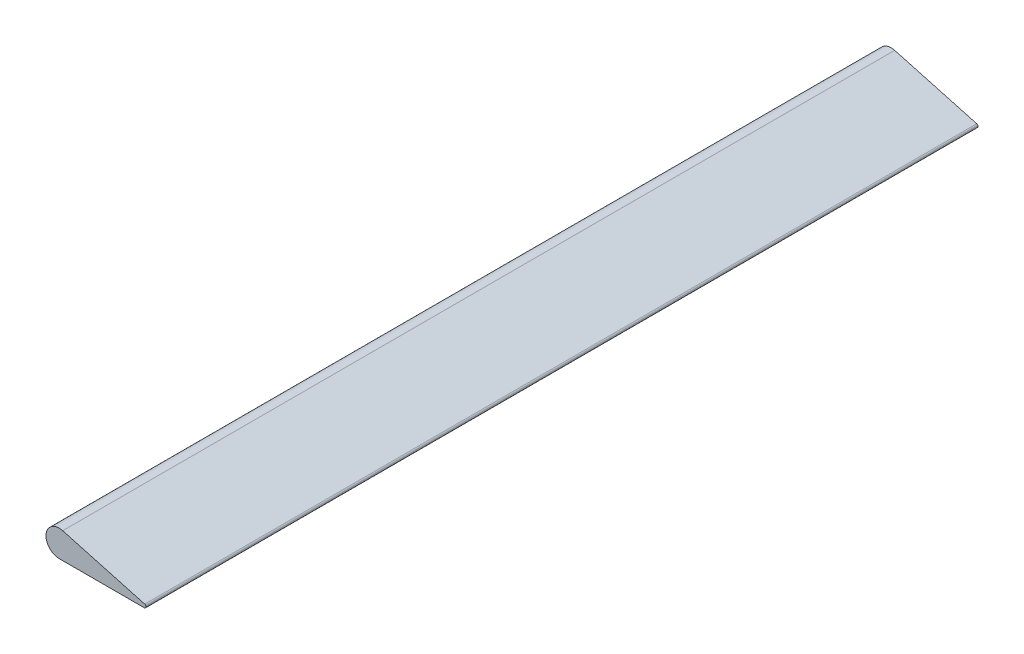
ISO-10303-21;
HEADER;
FILE_DESCRIPTION(('STEP AP214'),'2;1');
FILE_NAME('part.step','',(''),(''),'','','');
FILE_SCHEMA(('AUTOMOTIVE_DESIGN { 1 0 10303 214 1 1 1 1 }'));
ENDSEC;
DATA;
#1=APPLICATION_CONTEXT('core data for automotive mechanical design processes');
#2=APPLICATION_PROTOCOL_DEFINITION('international standard','automotive_design',2000,#1);
#3=PRODUCT_CONTEXT('',#1,'mechanical');
#4=PRODUCT('Part','Part','',(#3));
#5=PRODUCT_RELATED_PRODUCT_CATEGORY('part','',(#4));
#6=PRODUCT_DEFINITION_FORMATION('','',#4);
#7=PRODUCT_DEFINITION_CONTEXT('part definition',#1,'design');
#8=PRODUCT_DEFINITION('design','',#6,#7);
#9=PRODUCT_DEFINITION_SHAPE('','',#8);
#10=(LENGTH_UNIT() NAMED_UNIT(*) SI_UNIT(.MILLI.,.METRE.));
#11=(NAMED_UNIT(*) PLANE_ANGLE_UNIT() SI_UNIT($,.RADIAN.));
#12=(NAMED_UNIT(*) SI_UNIT($,.STERADIAN.) SOLID_ANGLE_UNIT());
#13=UNCERTAINTY_MEASURE_WITH_UNIT(LENGTH_MEASURE(1.E-05),#10,'distance_accuracy_value','');
#14=(GEOMETRIC_REPRESENTATION_CONTEXT(3) GLOBAL_UNCERTAINTY_ASSIGNED_CONTEXT((#13)) GLOBAL_UNIT_ASSIGNED_CONTEXT((#10,
#11,#12)) REPRESENTATION_CONTEXT('',''));
#15=CARTESIAN_POINT('',(0.,0.,0.));
#16=DIRECTION('',(0.,0.,1.));
#17=DIRECTION('',(1.,0.,0.));
#18=AXIS2_PLACEMENT_3D('',#15,#16,#17);
#19=CARTESIAN_POINT('',(446.391965644805,23.8886475423635,235.));
#20=DIRECTION('',(0.,0.,-1.));
#21=DIRECTION('',(-1.,0.,0.));
#22=AXIS2_PLACEMENT_3D('',#19,#20,#21);
#23=CYLINDRICAL_SURFACE('',#22,3.77619516282727);
#24=DIRECTION('',(0.,0.,-1.));
#25=VECTOR('',#24,1.);
#26=CARTESIAN_POINT('',(442.646192423976,23.4102827381828,235.));
#27=LINE('',#26,#25);
#28=CARTESIAN_POINT('',(442.646192423976,23.4102827381828,190.));
#29=VERTEX_POINT('',#28);
#30=CARTESIAN_POINT('',(442.646192423976,23.4102827381828,175.));
#31=VERTEX_POINT('',#30);
#32=EDGE_CURVE('E137',#29,#31,#27,.T.);
#33=ORIENTED_EDGE('',*,*,#32,.F.);
#34=CARTESIAN_POINT('',(446.391965644805,23.8886475423635,190.));
#35=DIRECTION('',(0.,0.,1.));
#36=DIRECTION('',(0.,-1.,0.));
#37=AXIS2_PLACEMENT_3D('',#34,#35,#36);
#38=CIRCLE('',#37,3.77619516282727);
#39=CARTESIAN_POINT('',(446.391965644805,20.1124523795362,190.));
#40=VERTEX_POINT('',#39);
#41=EDGE_CURVE('E179',#29,#40,#38,.T.);
#42=ORIENTED_EDGE('',*,*,#41,.T.);
#43=DIRECTION('',(0.,0.,-1.));
#44=VECTOR('',#43,1.);
#45=CARTESIAN_POINT('',(446.391965644805,20.1124523795362,235.));
#46=LINE('',#45,#44);
#47=CARTESIAN_POINT('',(446.391965644805,20.1124523795362,235.));
#48=VERTEX_POINT('',#47);
#49=EDGE_CURVE('E200',#48,#40,#46,.T.);
#50=ORIENTED_EDGE('',*,*,#49,.F.);
#51=CARTESIAN_POINT('',(446.391965644805,23.8886475423635,235.));
#52=DIRECTION('',(0.,0.,1.));
#53=DIRECTION('',(1.,0.,0.));
#54=AXIS2_PLACEMENT_3D('',#51,#52,#53);
#55=CIRCLE('',#54,3.77619516282727);
#56=CARTESIAN_POINT('',(447.390900991776,27.53031997139,235.));
#57=VERTEX_POINT('',#56);
#58=EDGE_CURVE('E183',#57,#48,#55,.T.);
#59=ORIENTED_EDGE('',*,*,#58,.F.);
#60=DIRECTION('',(0.,0.,-1.));
#61=VECTOR('',#60,1.);
#62=CARTESIAN_POINT('',(447.390900991776,27.53031997139,235.));
#63=LINE('',#62,#61);
#64=CARTESIAN_POINT('',(447.390900991776,27.53031997139,-3.00000000000022));
#65=VERTEX_POINT('',#64);
#66=EDGE_CURVE('E191',#57,#65,#63,.T.);
#67=ORIENTED_EDGE('',*,*,#66,.T.);
#68=CARTESIAN_POINT('',(446.391965644805,23.8886475423635,-3.00000000000022));
#69=DIRECTION('',(0.,0.,1.));
#70=DIRECTION('',(1.,0.,0.));
#71=AXIS2_PLACEMENT_3D('',#68,#69,#70);
#72=CIRCLE('',#71,3.77619516282727);
#73=CARTESIAN_POINT('',(446.391965644805,20.1124523795362,-3.00000000000022));
#74=VERTEX_POINT('',#73);
#75=EDGE_CURVE('E182',#65,#74,#72,.T.);
#76=ORIENTED_EDGE('',*,*,#75,.T.);
#77=CARTESIAN_POINT('',(446.391965644805,20.1124523795362,41.9999999999998));
#78=VERTEX_POINT('',#77);
#79=EDGE_CURVE('E199',#78,#74,#46,.T.);
#80=ORIENTED_EDGE('',*,*,#79,.F.);
#81=CARTESIAN_POINT('',(446.391965644805,23.8886475423635,41.9999999999998));
#82=DIRECTION('',(0.,0.,-1.));
#83=DIRECTION('',(-1.,0.,0.));
#84=AXIS2_PLACEMENT_3D('',#81,#82,#83);
#85=CIRCLE('',#84,3.77619516282727);
#86=CARTESIAN_POINT('',(442.646192423976,23.4102827381828,41.9999999999998));
#87=VERTEX_POINT('',#86);
#88=EDGE_CURVE('E157',#78,#87,#85,.T.);
#89=ORIENTED_EDGE('',*,*,#88,.T.);
#90=DIRECTION('',(0.,0.,-1.));
#91=VECTOR('',#90,1.);
#92=CARTESIAN_POINT('',(442.646192423976,23.4102827381828,235.));
#93=LINE('',#92,#91);
#94=CARTESIAN_POINT('',(442.646192423976,23.4102827381828,56.9999999999998));
#95=VERTEX_POINT('',#94);
#96=EDGE_CURVE('E219',#87,#95,#93,.F.);
#97=ORIENTED_EDGE('',*,*,#96,.T.);
#98=CARTESIAN_POINT('',(446.391965644805,23.8886475423635,56.9999999999998));
#99=DIRECTION('',(0.,0.,1.));
#100=DIRECTION('',(0.,-1.,0.));
#101=AXIS2_PLACEMENT_3D('',#98,#99,#100);
#102=CIRCLE('',#101,3.77619516282727);
#103=CARTESIAN_POINT('',(446.391965644805,20.1124523795362,56.9999999999998));
#104=VERTEX_POINT('',#103);
#105=EDGE_CURVE('E174',#95,#104,#102,.T.);
#106=ORIENTED_EDGE('',*,*,#105,.T.);
#107=CARTESIAN_POINT('',(446.391965644805,20.1124523795362,175.));
#108=VERTEX_POINT('',#107);
#109=EDGE_CURVE('E204',#108,#104,#46,.T.);
#110=ORIENTED_EDGE('',*,*,#109,.F.);
#111=CARTESIAN_POINT('',(446.391965644805,23.8886475423635,175.));
#112=DIRECTION('',(0.,0.,-1.));
#113=DIRECTION('',(0.,1.,0.));
#114=AXIS2_PLACEMENT_3D('',#111,#112,#113);
#115=CIRCLE('',#114,3.77619516282727);
#116=EDGE_CURVE('E177',#108,#31,#115,.T.);
#117=ORIENTED_EDGE('',*,*,#116,.T.);
#118=EDGE_LOOP('',(#33,#42,#50,#59,#67,#76,#80,#89,#97,#106,#110,#117));
#119=FACE_BOUND('',#118,.T.);
#120=ADVANCED_FACE('F41',(#119),#23,.T.);
#121=CARTESIAN_POINT('',(446.391965644805,20.1124523795362,235.));
#122=DIRECTION('',(0.,1.,0.));
#123=DIRECTION('',(-1.,0.,0.));
#124=AXIS2_PLACEMENT_3D('',#121,#122,#123);
#125=PLANE('',#124);
#126=DIRECTION('',(1.,0.,0.));
#127=VECTOR('',#126,1.);
#128=CARTESIAN_POINT('',(446.391965644805,20.1124523795362,-3.00000000000022));
#129=LINE('',#128,#127);
#130=CARTESIAN_POINT('',(470.720248748028,20.1124523795362,-3.00000000000022));
#131=VERTEX_POINT('',#130);
#132=EDGE_CURVE('E194',#74,#131,#129,.T.);
#133=ORIENTED_EDGE('',*,*,#132,.T.);
#134=DIRECTION('',(0.,0.,-1.));
#135=VECTOR('',#134,1.);
#136=CARTESIAN_POINT('',(470.720248748028,20.1124523795362,235.));
#137=LINE('',#136,#135);
#138=CARTESIAN_POINT('',(470.720248748028,20.1124523795362,235.));
#139=VERTEX_POINT('',#138);
#140=EDGE_CURVE('E49',#131,#139,#137,.F.);
#141=ORIENTED_EDGE('',*,*,#140,.T.);
#142=DIRECTION('',(1.,0.,0.));
#143=VECTOR('',#142,1.);
#144=CARTESIAN_POINT('',(446.391965644805,20.1124523795362,235.));
#145=LINE('',#144,#143);
#146=EDGE_CURVE('E186',#48,#139,#145,.T.);
#147=ORIENTED_EDGE('',*,*,#146,.F.);
#148=ORIENTED_EDGE('',*,*,#49,.T.);
#149=DIRECTION('',(1.,0.,0.));
#150=VECTOR('',#149,1.);
#151=CARTESIAN_POINT('',(446.391965644805,20.1124523795362,190.));
#152=LINE('',#151,#150);
#153=CARTESIAN_POINT('',(457.615770481978,20.1124523795362,190.));
#154=VERTEX_POINT('',#153);
#155=EDGE_CURVE('E216',#40,#154,#152,.T.);
#156=ORIENTED_EDGE('',*,*,#155,.T.);
#157=DIRECTION('',(0.,0.,-1.));
#158=VECTOR('',#157,1.);
#159=CARTESIAN_POINT('',(457.615770481978,20.1124523795362,235.));
#160=LINE('',#159,#158);
#161=CARTESIAN_POINT('',(457.615770481978,20.1124523795362,175.));
#162=VERTEX_POINT('',#161);
#163=EDGE_CURVE('E214',#154,#162,#160,.T.);
#164=ORIENTED_EDGE('',*,*,#163,.T.);
#165=DIRECTION('',(-1.,0.,0.));
#166=VECTOR('',#165,1.);
#167=CARTESIAN_POINT('',(446.391965644805,20.1124523795362,175.));
#168=LINE('',#167,#166);
#169=EDGE_CURVE('E146',#162,#108,#168,.T.);
#170=ORIENTED_EDGE('',*,*,#169,.T.);
#171=ORIENTED_EDGE('',*,*,#109,.T.);
#172=DIRECTION('',(1.,0.,0.));
#173=VECTOR('',#172,1.);
#174=CARTESIAN_POINT('',(446.391965644805,20.1124523795362,56.9999999999998));
#175=LINE('',#174,#173);
#176=CARTESIAN_POINT('',(457.615770481978,20.1124523795362,56.9999999999998));
#177=VERTEX_POINT('',#176);
#178=EDGE_CURVE('E210',#104,#177,#175,.T.);
#179=ORIENTED_EDGE('',*,*,#178,.T.);
#180=DIRECTION('',(0.,0.,-1.));
#181=VECTOR('',#180,1.);
#182=CARTESIAN_POINT('',(457.615770481978,20.1124523795362,235.));
#183=LINE('',#182,#181);
#184=CARTESIAN_POINT('',(457.615770481978,20.1124523795362,41.9999999999998));
#185=VERTEX_POINT('',#184);
#186=EDGE_CURVE('E207',#177,#185,#183,.T.);
#187=ORIENTED_EDGE('',*,*,#186,.T.);
#188=DIRECTION('',(-1.,0.,0.));
#189=VECTOR('',#188,1.);
#190=CARTESIAN_POINT('',(446.391965644806,20.1124523795362,41.9999999999998));
#191=LINE('',#190,#189);
#192=EDGE_CURVE('E203',#185,#78,#191,.T.);
#193=ORIENTED_EDGE('',*,*,#192,.T.);
#194=ORIENTED_EDGE('',*,*,#79,.T.);
#195=EDGE_LOOP('',(#133,#141,#147,#148,#156,#164,#170,#171,#179,#187,#193,#194));
#196=FACE_BOUND('',#195,.T.);
#197=ADVANCED_FACE('F247',(#196),#125,.F.);
#198=CARTESIAN_POINT('',(474.433135480061,20.1124523795362,235.));
#199=DIRECTION('',(-0.264534883367365,-0.964376117229069,0.));
#200=DIRECTION('',(0.964376117229069,-0.264534883367365,0.));
#201=AXIS2_PLACEMENT_3D('',#198,#199,#200);
#202=PLANE('',#201);
#203=DIRECTION('',(-0.964376117229069,0.264534883367365,0.));
#204=VECTOR('',#203,1.);
#205=CARTESIAN_POINT('',(474.433135480061,20.1124523795362,235.));
#206=LINE('',#205,#204);
#207=CARTESIAN_POINT('',(470.852516189712,21.0946404381507,235.));
#208=VERTEX_POINT('',#207);
#209=EDGE_CURVE('E189',#208,#57,#206,.T.);
#210=ORIENTED_EDGE('',*,*,#209,.F.);
#211=DIRECTION('',(0.,0.,-1.));
#212=VECTOR('',#211,1.);
#213=CARTESIAN_POINT('',(470.852516189712,21.0946404381507,235.));
#214=LINE('',#213,#212);
#215=CARTESIAN_POINT('',(470.852516189712,21.0946404381507,-3.00000000000022));
#216=VERTEX_POINT('',#215);
#217=EDGE_CURVE('E223',#208,#216,#214,.T.);
#218=ORIENTED_EDGE('',*,*,#217,.T.);
#219=DIRECTION('',(-0.964376117229069,0.264534883367365,0.));
#220=VECTOR('',#219,1.);
#221=CARTESIAN_POINT('',(474.433135480061,20.1124523795362,-3.00000000000022));
#222=LINE('',#221,#220);
#223=EDGE_CURVE('E187',#216,#65,#222,.T.);
#224=ORIENTED_EDGE('',*,*,#223,.T.);
#225=ORIENTED_EDGE('',*,*,#66,.F.);
#226=EDGE_LOOP('',(#210,#218,#224,#225));
#227=FACE_BOUND('',#226,.T.);
#228=ADVANCED_FACE('F229',(#227),#202,.F.);
#229=CARTESIAN_POINT('',(446.391965644805,23.8886475423635,235.));
#230=DIRECTION('',(0.,0.,1.));
#231=DIRECTION('',(1.,0.,0.));
#232=AXIS2_PLACEMENT_3D('',#229,#230,#231);
#233=PLANE('',#232);
#234=ORIENTED_EDGE('',*,*,#146,.T.);
#235=CARTESIAN_POINT('',(470.720248748028,20.6124523795362,235.));
#236=DIRECTION('',(0.,0.,1.));
#237=DIRECTION('',(1.,0.,0.));
#238=AXIS2_PLACEMENT_3D('',#235,#236,#237);
#239=CIRCLE('',#238,0.5);
#240=EDGE_CURVE('E11',#139,#208,#239,.T.);
#241=ORIENTED_EDGE('',*,*,#240,.T.);
#242=ORIENTED_EDGE('',*,*,#209,.T.);
#243=ORIENTED_EDGE('',*,*,#58,.T.);
#244=EDGE_LOOP('',(#234,#241,#242,#243));
#245=FACE_BOUND('',#244,.T.);
#246=ADVANCED_FACE('F240',(#245),#233,.T.);
#247=CARTESIAN_POINT('',(446.391965644805,23.8886475423635,-3.00000000000022));
#248=DIRECTION('',(0.,0.,1.));
#249=DIRECTION('',(1.,0.,0.));
#250=AXIS2_PLACEMENT_3D('',#247,#248,#249);
#251=PLANE('',#250);
#252=ORIENTED_EDGE('',*,*,#223,.F.);
#253=CARTESIAN_POINT('',(470.720248748028,20.6124523795362,-3.00000000000022));
#254=DIRECTION('',(0.,0.,1.));
#255=DIRECTION('',(1.,0.,0.));
#256=AXIS2_PLACEMENT_3D('',#253,#254,#255);
#257=CIRCLE('',#256,0.5);
#258=EDGE_CURVE('E63',#216,#131,#257,.F.);
#259=ORIENTED_EDGE('',*,*,#258,.T.);
#260=ORIENTED_EDGE('',*,*,#132,.F.);
#261=ORIENTED_EDGE('',*,*,#75,.F.);
#262=EDGE_LOOP('',(#252,#259,#260,#261));
#263=FACE_BOUND('',#262,.T.);
#264=ADVANCED_FACE('F234',(#263),#251,.F.);
#265=CARTESIAN_POINT('',(0.,23.4102827381828,0.));
#266=DIRECTION('',(0.,1.,0.));
#267=DIRECTION('',(0.,0.,1.));
#268=AXIS2_PLACEMENT_3D('',#265,#266,#267);
#269=PLANE('',#268);
#270=DIRECTION('',(1.,0.,0.));
#271=VECTOR('',#270,1.);
#272=CARTESIAN_POINT('',(442.615770481978,23.4102827381828,41.9999999999998));
#273=LINE('',#272,#271);
#274=CARTESIAN_POINT('',(457.615770481978,23.4102827381828,41.9999999999998));
#275=VERTEX_POINT('',#274);
#276=EDGE_CURVE('E159',#87,#275,#273,.T.);
#277=ORIENTED_EDGE('',*,*,#276,.T.);
#278=DIRECTION('',(0.,0.,1.));
#279=VECTOR('',#278,1.);
#280=CARTESIAN_POINT('',(457.615770481978,23.4102827381828,41.9999999999998));
#281=LINE('',#280,#279);
#282=CARTESIAN_POINT('',(457.615770481978,23.4102827381828,56.9999999999998));
#283=VERTEX_POINT('',#282);
#284=EDGE_CURVE('E161',#275,#283,#281,.T.);
#285=ORIENTED_EDGE('',*,*,#284,.T.);
#286=DIRECTION('',(-1.,0.,0.));
#287=VECTOR('',#286,1.);
#288=CARTESIAN_POINT('',(442.615770481978,23.4102827381828,56.9999999999998));
#289=LINE('',#288,#287);
#290=EDGE_CURVE('E164',#283,#95,#289,.T.);
#291=ORIENTED_EDGE('',*,*,#290,.T.);
#292=ORIENTED_EDGE('',*,*,#96,.F.);
#293=EDGE_LOOP('',(#277,#285,#291,#292));
#294=FACE_BOUND('',#293,.T.);
#295=ADVANCED_FACE('F257',(#294),#269,.F.);
#296=CARTESIAN_POINT('',(442.615770481978,23.4102827381828,56.9999999999998));
#297=DIRECTION('',(0.,0.,1.));
#298=DIRECTION('',(0.,-1.,0.));
#299=AXIS2_PLACEMENT_3D('',#296,#297,#298);
#300=PLANE('',#299);
#301=ORIENTED_EDGE('',*,*,#290,.F.);
#302=DIRECTION('',(0.,-1.,0.));
#303=VECTOR('',#302,1.);
#304=CARTESIAN_POINT('',(457.615770481978,23.4102827381828,56.9999999999998));
#305=LINE('',#304,#303);
#306=EDGE_CURVE('E140',#283,#177,#305,.T.);
#307=ORIENTED_EDGE('',*,*,#306,.T.);
#308=ORIENTED_EDGE('',*,*,#178,.F.);
#309=ORIENTED_EDGE('',*,*,#105,.F.);
#310=EDGE_LOOP('',(#301,#307,#308,#309));
#311=FACE_BOUND('',#310,.T.);
#312=ADVANCED_FACE('F267',(#311),#300,.F.);
#313=CARTESIAN_POINT('',(457.615770481978,23.4102827381828,41.9999999999998));
#314=DIRECTION('',(1.,0.,0.));
#315=DIRECTION('',(0.,0.,-1.));
#316=AXIS2_PLACEMENT_3D('',#313,#314,#315);
#317=PLANE('',#316);
#318=ORIENTED_EDGE('',*,*,#306,.F.);
#319=ORIENTED_EDGE('',*,*,#284,.F.);
#320=DIRECTION('',(0.,-1.,0.));
#321=VECTOR('',#320,1.);
#322=CARTESIAN_POINT('',(457.615770481978,23.4102827381828,41.9999999999998));
#323=LINE('',#322,#321);
#324=EDGE_CURVE('E167',#275,#185,#323,.T.);
#325=ORIENTED_EDGE('',*,*,#324,.T.);
#326=ORIENTED_EDGE('',*,*,#186,.F.);
#327=EDGE_LOOP('',(#318,#319,#325,#326));
#328=FACE_BOUND('',#327,.T.);
#329=ADVANCED_FACE('F263',(#328),#317,.F.);
#330=CARTESIAN_POINT('',(442.615770481978,23.4102827381828,41.9999999999998));
#331=DIRECTION('',(0.,0.,-1.));
#332=DIRECTION('',(-1.,0.,0.));
#333=AXIS2_PLACEMENT_3D('',#330,#331,#332);
#334=PLANE('',#333);
#335=ORIENTED_EDGE('',*,*,#192,.F.);
#336=ORIENTED_EDGE('',*,*,#324,.F.);
#337=ORIENTED_EDGE('',*,*,#276,.F.);
#338=ORIENTED_EDGE('',*,*,#88,.F.);
#339=EDGE_LOOP('',(#335,#336,#337,#338));
#340=FACE_BOUND('',#339,.T.);
#341=ADVANCED_FACE('F260',(#340),#334,.F.);
#342=CARTESIAN_POINT('',(0.,23.4102827381828,0.));
#343=DIRECTION('',(0.,-1.,0.));
#344=DIRECTION('',(0.,0.,-1.));
#345=AXIS2_PLACEMENT_3D('',#342,#343,#344);
#346=PLANE('',#345);
#347=ORIENTED_EDGE('',*,*,#32,.T.);
#348=DIRECTION('',(1.,0.,0.));
#349=VECTOR('',#348,1.);
#350=CARTESIAN_POINT('',(442.615770481978,23.4102827381828,175.));
#351=LINE('',#350,#349);
#352=CARTESIAN_POINT('',(457.615770481978,23.4102827381828,175.));
#353=VERTEX_POINT('',#352);
#354=EDGE_CURVE('E129',#31,#353,#351,.T.);
#355=ORIENTED_EDGE('',*,*,#354,.T.);
#356=DIRECTION('',(0.,0.,1.));
#357=VECTOR('',#356,1.);
#358=CARTESIAN_POINT('',(457.615770481978,23.4102827381828,190.));
#359=LINE('',#358,#357);
#360=CARTESIAN_POINT('',(457.615770481978,23.4102827381828,190.));
#361=VERTEX_POINT('',#360);
#362=EDGE_CURVE('E134',#353,#361,#359,.T.);
#363=ORIENTED_EDGE('',*,*,#362,.T.);
#364=DIRECTION('',(-1.,0.,0.));
#365=VECTOR('',#364,1.);
#366=CARTESIAN_POINT('',(442.615770481978,23.4102827381828,190.));
#367=LINE('',#366,#365);
#368=EDGE_CURVE('E150',#361,#29,#367,.T.);
#369=ORIENTED_EDGE('',*,*,#368,.T.);
#370=EDGE_LOOP('',(#347,#355,#363,#369));
#371=FACE_BOUND('',#370,.T.);
#372=ADVANCED_FACE('F131',(#371),#346,.T.);
#373=CARTESIAN_POINT('',(442.615770481978,23.4102827381828,190.));
#374=DIRECTION('',(0.,0.,1.));
#375=DIRECTION('',(0.,-1.,0.));
#376=AXIS2_PLACEMENT_3D('',#373,#374,#375);
#377=PLANE('',#376);
#378=ORIENTED_EDGE('',*,*,#368,.F.);
#379=DIRECTION('',(0.,-1.,0.));
#380=VECTOR('',#379,1.);
#381=CARTESIAN_POINT('',(457.615770481978,23.4102827381828,190.));
#382=LINE('',#381,#380);
#383=EDGE_CURVE('E149',#361,#154,#382,.T.);
#384=ORIENTED_EDGE('',*,*,#383,.T.);
#385=ORIENTED_EDGE('',*,*,#155,.F.);
#386=ORIENTED_EDGE('',*,*,#41,.F.);
#387=EDGE_LOOP('',(#378,#384,#385,#386));
#388=FACE_BOUND('',#387,.T.);
#389=ADVANCED_FACE('F277',(#388),#377,.F.);
#390=CARTESIAN_POINT('',(457.615770481978,23.4102827381828,190.));
#391=DIRECTION('',(1.,0.,0.));
#392=DIRECTION('',(0.,0.,-1.));
#393=AXIS2_PLACEMENT_3D('',#390,#391,#392);
#394=PLANE('',#393);
#395=ORIENTED_EDGE('',*,*,#383,.F.);
#396=ORIENTED_EDGE('',*,*,#362,.F.);
#397=DIRECTION('',(0.,-1.,0.));
#398=VECTOR('',#397,1.);
#399=CARTESIAN_POINT('',(457.615770481978,23.4102827381828,175.));
#400=LINE('',#399,#398);
#401=EDGE_CURVE('E143',#353,#162,#400,.T.);
#402=ORIENTED_EDGE('',*,*,#401,.T.);
#403=ORIENTED_EDGE('',*,*,#163,.F.);
#404=EDGE_LOOP('',(#395,#396,#402,#403));
#405=FACE_BOUND('',#404,.T.);
#406=ADVANCED_FACE('F152',(#405),#394,.F.);
#407=CARTESIAN_POINT('',(442.615770481978,23.4102827381828,175.));
#408=DIRECTION('',(0.,0.,-1.));
#409=DIRECTION('',(0.,1.,0.));
#410=AXIS2_PLACEMENT_3D('',#407,#408,#409);
#411=PLANE('',#410);
#412=ORIENTED_EDGE('',*,*,#169,.F.);
#413=ORIENTED_EDGE('',*,*,#401,.F.);
#414=ORIENTED_EDGE('',*,*,#354,.F.);
#415=ORIENTED_EDGE('',*,*,#116,.F.);
#416=EDGE_LOOP('',(#412,#413,#414,#415));
#417=FACE_BOUND('',#416,.T.);
#418=ADVANCED_FACE('F144',(#417),#411,.F.);
#419=CARTESIAN_POINT('',(470.720248748028,20.6124523795362,235.));
#420=DIRECTION('',(0.,0.,-1.));
#421=DIRECTION('',(-1.,0.,0.));
#422=AXIS2_PLACEMENT_3D('',#419,#420,#421);
#423=CYLINDRICAL_SURFACE('',#422,0.5);
#424=ORIENTED_EDGE('',*,*,#240,.F.);
#425=ORIENTED_EDGE('',*,*,#140,.F.);
#426=ORIENTED_EDGE('',*,*,#258,.F.);
#427=ORIENTED_EDGE('',*,*,#217,.F.);
#428=EDGE_LOOP('',(#424,#425,#426,#427));
#429=FACE_BOUND('',#428,.T.);
#430=ADVANCED_FACE('F43',(#429),#423,.T.);
#431=CLOSED_SHELL('',(#120,#197,#228,#246,#264,#295,#312,#329,#341,#372,#389,#406,#418,#430));
#432=MANIFOLD_SOLID_BREP('B2',#431);
#433=ADVANCED_BREP_SHAPE_REPRESENTATION('',(#18,#432),#14);
#434=SHAPE_DEFINITION_REPRESENTATION(#9,#433);
ENDSEC;
END-ISO-10303-21;
